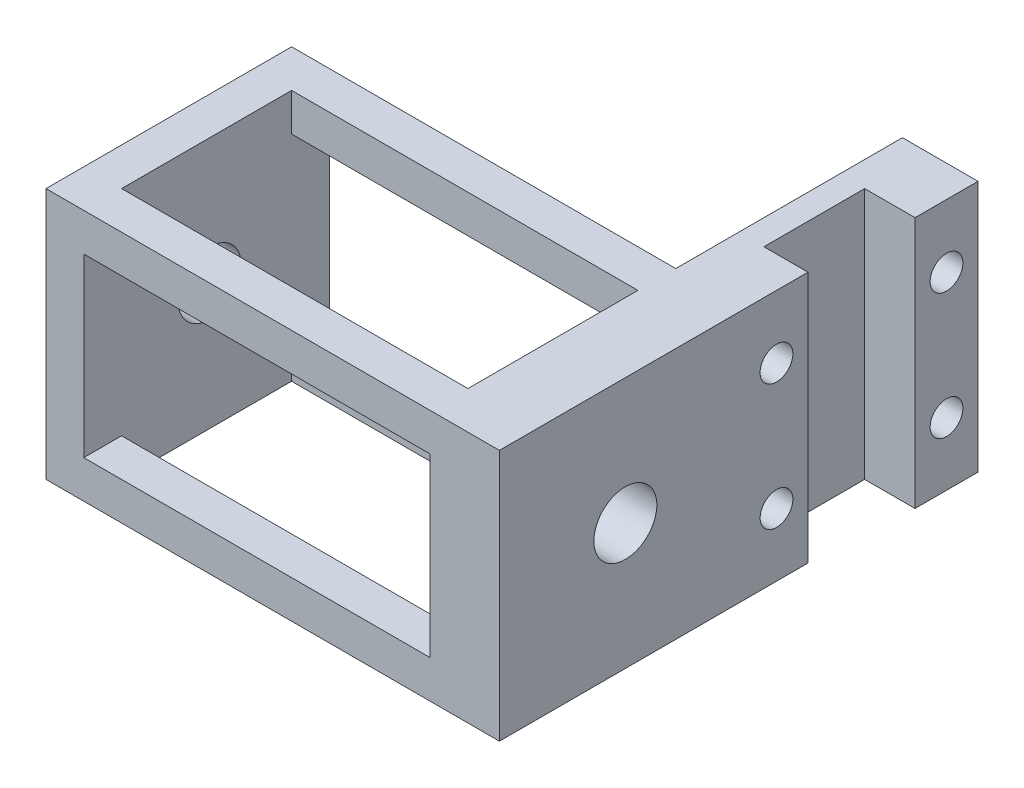
ISO-10303-21;
HEADER;
FILE_DESCRIPTION(('STEP AP214'),'2;1');
FILE_NAME('part.step','',(''),(''),'','','');
FILE_SCHEMA(('AUTOMOTIVE_DESIGN { 1 0 10303 214 1 1 1 1 }'));
ENDSEC;
DATA;
#1=APPLICATION_CONTEXT('core data for automotive mechanical design processes');
#2=APPLICATION_PROTOCOL_DEFINITION('international standard','automotive_design',2000,#1);
#3=PRODUCT_CONTEXT('',#1,'mechanical');
#4=PRODUCT('Part','Part','',(#3));
#5=PRODUCT_RELATED_PRODUCT_CATEGORY('part','',(#4));
#6=PRODUCT_DEFINITION_FORMATION('','',#4);
#7=PRODUCT_DEFINITION_CONTEXT('part definition',#1,'design');
#8=PRODUCT_DEFINITION('design','',#6,#7);
#9=PRODUCT_DEFINITION_SHAPE('','',#8);
#10=(LENGTH_UNIT() NAMED_UNIT(*) SI_UNIT(.MILLI.,.METRE.));
#11=(NAMED_UNIT(*) PLANE_ANGLE_UNIT() SI_UNIT($,.RADIAN.));
#12=(NAMED_UNIT(*) SI_UNIT($,.STERADIAN.) SOLID_ANGLE_UNIT());
#13=UNCERTAINTY_MEASURE_WITH_UNIT(LENGTH_MEASURE(1.E-05),#10,'distance_accuracy_value','');
#14=(GEOMETRIC_REPRESENTATION_CONTEXT(3) GLOBAL_UNCERTAINTY_ASSIGNED_CONTEXT((#13)) GLOBAL_UNIT_ASSIGNED_CONTEXT((#10,
#11,#12)) REPRESENTATION_CONTEXT('',''));
#15=CARTESIAN_POINT('',(0.,0.,0.));
#16=DIRECTION('',(0.,0.,1.));
#17=DIRECTION('',(1.,0.,0.));
#18=AXIS2_PLACEMENT_3D('',#15,#16,#17);
#19=CARTESIAN_POINT('',(-8.39344262295084,-0.001000000000001,19.1311475409836));
#20=DIRECTION('',(0.,0.,1.));
#21=DIRECTION('',(1.,0.,0.));
#22=AXIS2_PLACEMENT_3D('',#19,#20,#21);
#23=PLANE('',#22);
#24=DIRECTION('',(0.,1.,0.));
#25=VECTOR('',#24,1.);
#26=CARTESIAN_POINT('',(-8.39344262295084,-0.001000000000001,19.1311475409836));
#27=LINE('',#26,#25);
#28=CARTESIAN_POINT('',(-8.39344262295083,17.,19.1311475409836));
#29=VERTEX_POINT('',#28);
#30=CARTESIAN_POINT('',(-8.39344262295084,20.,19.1311475409836));
#31=VERTEX_POINT('',#30);
#32=EDGE_CURVE('E285',#29,#31,#27,.T.);
#33=ORIENTED_EDGE('',*,*,#32,.F.);
#34=DIRECTION('',(-1.,0.,0.));
#35=VECTOR('',#34,1.);
#36=CARTESIAN_POINT('',(-8.39344262295084,17.,19.1311475409836));
#37=LINE('',#36,#35);
#38=CARTESIAN_POINT('',(-35.8934426229508,17.,19.1311475409836));
#39=VERTEX_POINT('',#38);
#40=EDGE_CURVE('E241',#29,#39,#37,.T.);
#41=ORIENTED_EDGE('',*,*,#40,.T.);
#42=DIRECTION('',(0.,1.,0.));
#43=VECTOR('',#42,1.);
#44=CARTESIAN_POINT('',(-35.8934426229508,-0.001000000000001,19.1311475409836));
#45=LINE('',#44,#43);
#46=CARTESIAN_POINT('',(-35.8934426229508,20.,19.1311475409836));
#47=VERTEX_POINT('',#46);
#48=EDGE_CURVE('E287',#39,#47,#45,.T.);
#49=ORIENTED_EDGE('',*,*,#48,.T.);
#50=DIRECTION('',(1.,0.,0.));
#51=VECTOR('',#50,1.);
#52=CARTESIAN_POINT('',(-8.39344262295084,20.,19.1311475409836));
#53=LINE('',#52,#51);
#54=EDGE_CURVE('E273',#47,#31,#53,.T.);
#55=ORIENTED_EDGE('',*,*,#54,.T.);
#56=EDGE_LOOP('',(#33,#41,#49,#55));
#57=FACE_BOUND('',#56,.T.);
#58=ADVANCED_FACE('F44',(#57),#23,.F.);
#59=CARTESIAN_POINT('',(-8.39344262295084,-0.001000000000001,5.6311475409836));
#60=DIRECTION('',(0.,0.,-1.));
#61=DIRECTION('',(-1.,0.,0.));
#62=AXIS2_PLACEMENT_3D('',#59,#60,#61);
#63=PLANE('',#62);
#64=DIRECTION('',(0.,1.,0.));
#65=VECTOR('',#64,1.);
#66=CARTESIAN_POINT('',(-35.8934426229508,-0.001000000000001,5.6311475409836));
#67=LINE('',#66,#65);
#68=CARTESIAN_POINT('',(-35.8934426229508,17.,5.6311475409836));
#69=VERTEX_POINT('',#68);
#70=CARTESIAN_POINT('',(-35.8934426229508,20.,5.6311475409836));
#71=VERTEX_POINT('',#70);
#72=EDGE_CURVE('E295',#69,#71,#67,.T.);
#73=ORIENTED_EDGE('',*,*,#72,.F.);
#74=DIRECTION('',(1.,0.,0.));
#75=VECTOR('',#74,1.);
#76=CARTESIAN_POINT('',(-8.39344262295084,17.,5.6311475409836));
#77=LINE('',#76,#75);
#78=CARTESIAN_POINT('',(-8.39344262295083,17.,5.6311475409836));
#79=VERTEX_POINT('',#78);
#80=EDGE_CURVE('E54',#69,#79,#77,.T.);
#81=ORIENTED_EDGE('',*,*,#80,.T.);
#82=DIRECTION('',(0.,1.,0.));
#83=VECTOR('',#82,1.);
#84=CARTESIAN_POINT('',(-8.39344262295084,-0.001000000000001,5.6311475409836));
#85=LINE('',#84,#83);
#86=CARTESIAN_POINT('',(-8.39344262295084,20.,5.6311475409836));
#87=VERTEX_POINT('',#86);
#88=EDGE_CURVE('E279',#79,#87,#85,.T.);
#89=ORIENTED_EDGE('',*,*,#88,.T.);
#90=DIRECTION('',(-1.,0.,0.));
#91=VECTOR('',#90,1.);
#92=CARTESIAN_POINT('',(-8.39344262295084,20.,5.6311475409836));
#93=LINE('',#92,#91);
#94=EDGE_CURVE('E266',#87,#71,#93,.T.);
#95=ORIENTED_EDGE('',*,*,#94,.T.);
#96=EDGE_LOOP('',(#73,#81,#89,#95));
#97=FACE_BOUND('',#96,.T.);
#98=ADVANCED_FACE('F417',(#97),#63,.F.);
#99=CARTESIAN_POINT('',(-6.39344262295083,20.,-2.3688524590164));
#100=DIRECTION('',(0.,0.,1.));
#101=DIRECTION('',(1.,0.,0.));
#102=AXIS2_PLACEMENT_3D('',#99,#100,#101);
#103=PLANE('',#102);
#104=DIRECTION('',(-1.,0.,0.));
#105=VECTOR('',#104,1.);
#106=CARTESIAN_POINT('',(-6.39344262295083,0.,-2.3688524590164));
#107=LINE('',#106,#105);
#108=CARTESIAN_POINT('',(-2.89344262295083,0.,-2.3688524590164));
#109=VERTEX_POINT('',#108);
#110=CARTESIAN_POINT('',(-6.39344262295083,0.,-2.3688524590164));
#111=VERTEX_POINT('',#110);
#112=EDGE_CURVE('E321',#109,#111,#107,.T.);
#113=ORIENTED_EDGE('',*,*,#112,.T.);
#114=DIRECTION('',(0.,-1.,0.));
#115=VECTOR('',#114,1.);
#116=CARTESIAN_POINT('',(-6.39344262295083,20.,-2.3688524590164));
#117=LINE('',#116,#115);
#118=CARTESIAN_POINT('',(-6.39344262295083,20.,-2.3688524590164));
#119=VERTEX_POINT('',#118);
#120=EDGE_CURVE('E404',#119,#111,#117,.T.);
#121=ORIENTED_EDGE('',*,*,#120,.F.);
#122=DIRECTION('',(-1.,0.,0.));
#123=VECTOR('',#122,1.);
#124=CARTESIAN_POINT('',(-6.39344262295083,20.,-2.3688524590164));
#125=LINE('',#124,#123);
#126=CARTESIAN_POINT('',(-2.89344262295083,20.,-2.3688524590164));
#127=VERTEX_POINT('',#126);
#128=EDGE_CURVE('E328',#127,#119,#125,.T.);
#129=ORIENTED_EDGE('',*,*,#128,.F.);
#130=DIRECTION('',(0.,-1.,0.));
#131=VECTOR('',#130,1.);
#132=CARTESIAN_POINT('',(-2.89344262295083,20.,-2.3688524590164));
#133=LINE('',#132,#131);
#134=EDGE_CURVE('E356',#127,#109,#133,.T.);
#135=ORIENTED_EDGE('',*,*,#134,.T.);
#136=EDGE_LOOP('',(#113,#121,#129,#135));
#137=FACE_BOUND('',#136,.T.);
#138=ADVANCED_FACE('F50',(#137),#103,.F.);
#139=CARTESIAN_POINT('',(-6.39344262295083,20.,-10.3688524590164));
#140=DIRECTION('',(-1.,0.,0.));
#141=DIRECTION('',(0.,0.,1.));
#142=AXIS2_PLACEMENT_3D('',#139,#140,#141);
#143=PLANE('',#142);
#144=DIRECTION('',(0.,0.,-1.));
#145=VECTOR('',#144,1.);
#146=CARTESIAN_POINT('',(-6.39344262295083,0.,-10.3688524590164));
#147=LINE('',#146,#145);
#148=CARTESIAN_POINT('',(-6.39344262295083,0.,-10.3688524590164));
#149=VERTEX_POINT('',#148);
#150=EDGE_CURVE('E360',#111,#149,#147,.T.);
#151=ORIENTED_EDGE('',*,*,#150,.T.);
#152=DIRECTION('',(0.,-1.,0.));
#153=VECTOR('',#152,1.);
#154=CARTESIAN_POINT('',(-6.39344262295083,20.,-10.3688524590164));
#155=LINE('',#154,#153);
#156=CARTESIAN_POINT('',(-6.39344262295083,20.,-10.3688524590164));
#157=VERTEX_POINT('',#156);
#158=EDGE_CURVE('E400',#157,#149,#155,.T.);
#159=ORIENTED_EDGE('',*,*,#158,.F.);
#160=DIRECTION('',(0.,0.,-1.));
#161=VECTOR('',#160,1.);
#162=CARTESIAN_POINT('',(-6.39344262295083,20.,-10.3688524590164));
#163=LINE('',#162,#161);
#164=EDGE_CURVE('E334',#119,#157,#163,.T.);
#165=ORIENTED_EDGE('',*,*,#164,.F.);
#166=ORIENTED_EDGE('',*,*,#120,.T.);
#167=EDGE_LOOP('',(#151,#159,#165,#166));
#168=FACE_BOUND('',#167,.T.);
#169=ADVANCED_FACE('F541',(#168),#143,.F.);
#170=CARTESIAN_POINT('',(-2.39344262295083,20.,-10.3688524590164));
#171=DIRECTION('',(0.,0.,-1.));
#172=DIRECTION('',(-1.,0.,0.));
#173=AXIS2_PLACEMENT_3D('',#170,#171,#172);
#174=PLANE('',#173);
#175=DIRECTION('',(1.,0.,0.));
#176=VECTOR('',#175,1.);
#177=CARTESIAN_POINT('',(-2.39344262295083,0.,-10.3688524590164));
#178=LINE('',#177,#176);
#179=CARTESIAN_POINT('',(-2.39344262295083,0.,-10.3688524590164));
#180=VERTEX_POINT('',#179);
#181=EDGE_CURVE('E361',#149,#180,#178,.T.);
#182=ORIENTED_EDGE('',*,*,#181,.T.);
#183=DIRECTION('',(0.,-1.,0.));
#184=VECTOR('',#183,1.);
#185=CARTESIAN_POINT('',(-2.39344262295083,20.,-10.3688524590164));
#186=LINE('',#185,#184);
#187=CARTESIAN_POINT('',(-2.39344262295083,20.,-10.3688524590164));
#188=VERTEX_POINT('',#187);
#189=EDGE_CURVE('E396',#188,#180,#186,.T.);
#190=ORIENTED_EDGE('',*,*,#189,.F.);
#191=DIRECTION('',(1.,0.,0.));
#192=VECTOR('',#191,1.);
#193=CARTESIAN_POINT('',(-2.39344262295083,20.,-10.3688524590164));
#194=LINE('',#193,#192);
#195=EDGE_CURVE('E340',#157,#188,#194,.T.);
#196=ORIENTED_EDGE('',*,*,#195,.F.);
#197=ORIENTED_EDGE('',*,*,#158,.T.);
#198=EDGE_LOOP('',(#182,#190,#196,#197));
#199=FACE_BOUND('',#198,.T.);
#200=ADVANCED_FACE('F591',(#199),#174,.F.);
#201=CARTESIAN_POINT('',(-2.39344262295083,20.,-15.3688524590164));
#202=DIRECTION('',(-1.,0.,0.));
#203=DIRECTION('',(0.,0.,1.));
#204=AXIS2_PLACEMENT_3D('',#201,#202,#203);
#205=PLANE('',#204);
#206=CARTESIAN_POINT('',(-2.39344262295083,5.,-12.8688524590164));
#207=DIRECTION('',(1.,0.,0.));
#208=DIRECTION('',(0.,0.,-1.));
#209=AXIS2_PLACEMENT_3D('',#206,#207,#208);
#210=CIRCLE('',#209,1.3);
#211=CARTESIAN_POINT('',(-2.39344262295083,5.,-14.1688524590164));
#212=VERTEX_POINT('',#211);
#213=EDGE_CURVE('E495',#212,#212,#210,.T.);
#214=ORIENTED_EDGE('',*,*,#213,.F.);
#215=EDGE_LOOP('',(#214));
#216=FACE_BOUND('',#215,.T.);
#217=CARTESIAN_POINT('',(-2.39344262295083,15.,-12.8688524590164));
#218=DIRECTION('',(1.,0.,0.));
#219=DIRECTION('',(0.,0.,1.));
#220=AXIS2_PLACEMENT_3D('',#217,#218,#219);
#221=CIRCLE('',#220,1.3);
#222=CARTESIAN_POINT('',(-2.39344262295083,15.,-11.5688524590164));
#223=VERTEX_POINT('',#222);
#224=EDGE_CURVE('E488',#223,#223,#221,.T.);
#225=ORIENTED_EDGE('',*,*,#224,.F.);
#226=EDGE_LOOP('',(#225));
#227=FACE_BOUND('',#226,.T.);
#228=DIRECTION('',(0.,0.,-1.));
#229=VECTOR('',#228,1.);
#230=CARTESIAN_POINT('',(-2.39344262295083,0.,-15.3688524590164));
#231=LINE('',#230,#229);
#232=CARTESIAN_POINT('',(-2.39344262295083,0.,-15.3688524590164));
#233=VERTEX_POINT('',#232);
#234=EDGE_CURVE('E368',#180,#233,#231,.T.);
#235=ORIENTED_EDGE('',*,*,#234,.T.);
#236=DIRECTION('',(0.,-1.,0.));
#237=VECTOR('',#236,1.);
#238=CARTESIAN_POINT('',(-2.39344262295083,20.,-15.3688524590164));
#239=LINE('',#238,#237);
#240=CARTESIAN_POINT('',(-2.39344262295083,20.,-15.3688524590164));
#241=VERTEX_POINT('',#240);
#242=EDGE_CURVE('E395',#241,#233,#239,.T.);
#243=ORIENTED_EDGE('',*,*,#242,.F.);
#244=DIRECTION('',(0.,0.,-1.));
#245=VECTOR('',#244,1.);
#246=CARTESIAN_POINT('',(-2.39344262295083,20.,-15.3688524590164));
#247=LINE('',#246,#245);
#248=EDGE_CURVE('E339',#188,#241,#247,.T.);
#249=ORIENTED_EDGE('',*,*,#248,.F.);
#250=ORIENTED_EDGE('',*,*,#189,.T.);
#251=EDGE_LOOP('',(#235,#243,#249,#250));
#252=FACE_BOUND('',#251,.T.);
#253=ADVANCED_FACE('F594',(#216,#227,#252),#205,.F.);
#254=CARTESIAN_POINT('',(-8.39344262295084,20.,-15.3688524590164));
#255=DIRECTION('',(0.,0.,1.));
#256=DIRECTION('',(1.,0.,0.));
#257=AXIS2_PLACEMENT_3D('',#254,#255,#256);
#258=PLANE('',#257);
#259=DIRECTION('',(-1.,0.,0.));
#260=VECTOR('',#259,1.);
#261=CARTESIAN_POINT('',(-8.39344262295084,0.,-15.3688524590164));
#262=LINE('',#261,#260);
#263=CARTESIAN_POINT('',(-8.39344262295084,0.,-15.3688524590164));
#264=VERTEX_POINT('',#263);
#265=EDGE_CURVE('E369',#233,#264,#262,.T.);
#266=ORIENTED_EDGE('',*,*,#265,.T.);
#267=DIRECTION('',(0.,-1.,0.));
#268=VECTOR('',#267,1.);
#269=CARTESIAN_POINT('',(-8.39344262295084,20.,-15.3688524590164));
#270=LINE('',#269,#268);
#271=CARTESIAN_POINT('',(-8.39344262295084,20.,-15.3688524590164));
#272=VERTEX_POINT('',#271);
#273=EDGE_CURVE('E386',#272,#264,#270,.T.);
#274=ORIENTED_EDGE('',*,*,#273,.F.);
#275=DIRECTION('',(-1.,0.,0.));
#276=VECTOR('',#275,1.);
#277=CARTESIAN_POINT('',(-8.39344262295084,20.,-15.3688524590164));
#278=LINE('',#277,#276);
#279=EDGE_CURVE('E344',#241,#272,#278,.T.);
#280=ORIENTED_EDGE('',*,*,#279,.F.);
#281=ORIENTED_EDGE('',*,*,#242,.T.);
#282=EDGE_LOOP('',(#266,#274,#280,#281));
#283=FACE_BOUND('',#282,.T.);
#284=ADVANCED_FACE('F549',(#283),#258,.F.);
#285=CARTESIAN_POINT('',(-8.39344262295083,20.,22.1311475409836));
#286=DIRECTION('',(1.,0.,0.));
#287=DIRECTION('',(0.,0.,-1.));
#288=AXIS2_PLACEMENT_3D('',#285,#286,#287);
#289=PLANE('',#288);
#290=CARTESIAN_POINT('',(-8.39344262295083,5.,0.1311475409836));
#291=DIRECTION('',(1.,0.,0.));
#292=DIRECTION('',(0.,0.,-1.));
#293=AXIS2_PLACEMENT_3D('',#290,#291,#292);
#294=CIRCLE('',#293,1.3);
#295=CARTESIAN_POINT('',(-8.39344262295083,5.,-1.1688524590164));
#296=VERTEX_POINT('',#295);
#297=EDGE_CURVE('E500',#296,#296,#294,.F.);
#298=ORIENTED_EDGE('',*,*,#297,.F.);
#299=EDGE_LOOP('',(#298));
#300=FACE_BOUND('',#299,.T.);
#301=CARTESIAN_POINT('',(-8.39344262295083,15.,0.1311475409836));
#302=DIRECTION('',(1.,0.,0.));
#303=DIRECTION('',(0.,0.,-1.));
#304=AXIS2_PLACEMENT_3D('',#301,#302,#303);
#305=CIRCLE('',#304,1.3);
#306=CARTESIAN_POINT('',(-8.39344262295083,15.,-1.1688524590164));
#307=VERTEX_POINT('',#306);
#308=EDGE_CURVE('E508',#307,#307,#305,.F.);
#309=ORIENTED_EDGE('',*,*,#308,.F.);
#310=EDGE_LOOP('',(#309));
#311=FACE_BOUND('',#310,.T.);
#312=CARTESIAN_POINT('',(-8.39344262295084,5.,-12.8688524590164));
#313=DIRECTION('',(1.,0.,0.));
#314=DIRECTION('',(0.,0.,-1.));
#315=AXIS2_PLACEMENT_3D('',#312,#313,#314);
#316=CIRCLE('',#315,1.3);
#317=CARTESIAN_POINT('',(-8.39344262295084,5.,-14.1688524590164));
#318=VERTEX_POINT('',#317);
#319=EDGE_CURVE('E490',#318,#318,#316,.F.);
#320=ORIENTED_EDGE('',*,*,#319,.F.);
#321=EDGE_LOOP('',(#320));
#322=FACE_BOUND('',#321,.T.);
#323=CARTESIAN_POINT('',(-8.39344262295084,15.,-12.8688524590164));
#324=DIRECTION('',(1.,0.,0.));
#325=DIRECTION('',(0.,0.,-1.));
#326=AXIS2_PLACEMENT_3D('',#323,#324,#325);
#327=CIRCLE('',#326,1.3);
#328=CARTESIAN_POINT('',(-8.39344262295084,15.,-14.1688524590164));
#329=VERTEX_POINT('',#328);
#330=EDGE_CURVE('E492',#329,#329,#327,.F.);
#331=ORIENTED_EDGE('',*,*,#330,.F.);
#332=EDGE_LOOP('',(#331));
#333=FACE_BOUND('',#332,.T.);
#334=CARTESIAN_POINT('',(-8.39344262295083,10.,12.1311475409836));
#335=DIRECTION('',(1.,0.,0.));
#336=DIRECTION('',(0.,0.,-1.));
#337=AXIS2_PLACEMENT_3D('',#334,#335,#336);
#338=CIRCLE('',#337,2.5);
#339=CARTESIAN_POINT('',(-8.39344262295083,10.,9.6311475409836));
#340=VERTEX_POINT('',#339);
#341=EDGE_CURVE('E475',#340,#340,#338,.T.);
#342=ORIENTED_EDGE('',*,*,#341,.T.);
#343=EDGE_LOOP('',(#342));
#344=FACE_BOUND('',#343,.T.);
#345=ORIENTED_EDGE('',*,*,#273,.T.);
#346=DIRECTION('',(0.,0.,1.));
#347=VECTOR('',#346,1.);
#348=CARTESIAN_POINT('',(-8.39344262295083,0.,22.1311475409836));
#349=LINE('',#348,#347);
#350=CARTESIAN_POINT('',(-8.39344262295083,0.,2.6311475409836));
#351=VERTEX_POINT('',#350);
#352=EDGE_CURVE('E373',#264,#351,#349,.T.);
#353=ORIENTED_EDGE('',*,*,#352,.T.);
#354=DIRECTION('',(0.,1.,0.));
#355=VECTOR('',#354,1.);
#356=CARTESIAN_POINT('',(-8.39344262295083,0.,2.6311475409836));
#357=LINE('',#356,#355);
#358=CARTESIAN_POINT('',(-8.39344262295083,3.,2.6311475409836));
#359=VERTEX_POINT('',#358);
#360=EDGE_CURVE('E324',#351,#359,#357,.T.);
#361=ORIENTED_EDGE('',*,*,#360,.T.);
#362=DIRECTION('',(0.,0.,1.));
#363=VECTOR('',#362,1.);
#364=CARTESIAN_POINT('',(-8.39344262295083,3.,-15.3688524590164));
#365=LINE('',#364,#363);
#366=CARTESIAN_POINT('',(-8.39344262295083,3.,5.6311475409836));
#367=VERTEX_POINT('',#366);
#368=EDGE_CURVE('E70',#359,#367,#365,.T.);
#369=ORIENTED_EDGE('',*,*,#368,.T.);
#370=CARTESIAN_POINT('',(-8.39344262295084,0.,5.6311475409836));
#371=VERTEX_POINT('',#370);
#372=EDGE_CURVE('E291',#371,#367,#85,.T.);
#373=ORIENTED_EDGE('',*,*,#372,.F.);
#374=DIRECTION('',(0.,0.,-1.));
#375=VECTOR('',#374,1.);
#376=CARTESIAN_POINT('',(-8.39344262295084,0.,19.1311475409836));
#377=LINE('',#376,#375);
#378=CARTESIAN_POINT('',(-8.39344262295084,0.,19.1311475409836));
#379=VERTEX_POINT('',#378);
#380=EDGE_CURVE('E256',#379,#371,#377,.T.);
#381=ORIENTED_EDGE('',*,*,#380,.F.);
#382=CARTESIAN_POINT('',(-8.39344262295084,3.,19.1311475409836));
#383=VERTEX_POINT('',#382);
#384=EDGE_CURVE('E204',#379,#383,#27,.T.);
#385=ORIENTED_EDGE('',*,*,#384,.T.);
#386=CARTESIAN_POINT('',(-8.39344262295083,3.,22.1311475409836));
#387=VERTEX_POINT('',#386);
#388=EDGE_CURVE('E198',#383,#387,#365,.T.);
#389=ORIENTED_EDGE('',*,*,#388,.T.);
#390=DIRECTION('',(0.,1.,0.));
#391=VECTOR('',#390,1.);
#392=CARTESIAN_POINT('',(-8.39344262295083,17.,22.1311475409836));
#393=LINE('',#392,#391);
#394=CARTESIAN_POINT('',(-8.39344262295083,17.,22.1311475409836));
#395=VERTEX_POINT('',#394);
#396=EDGE_CURVE('E203',#387,#395,#393,.T.);
#397=ORIENTED_EDGE('',*,*,#396,.T.);
#398=DIRECTION('',(0.,0.,1.));
#399=VECTOR('',#398,1.);
#400=CARTESIAN_POINT('',(-8.39344262295083,17.,-15.3688524590164));
#401=LINE('',#400,#399);
#402=EDGE_CURVE('E232',#29,#395,#401,.T.);
#403=ORIENTED_EDGE('',*,*,#402,.F.);
#404=ORIENTED_EDGE('',*,*,#32,.T.);
#405=DIRECTION('',(0.,0.,-1.));
#406=VECTOR('',#405,1.);
#407=CARTESIAN_POINT('',(-8.39344262295084,20.,19.1311475409836));
#408=LINE('',#407,#406);
#409=EDGE_CURVE('E265',#31,#87,#408,.T.);
#410=ORIENTED_EDGE('',*,*,#409,.T.);
#411=ORIENTED_EDGE('',*,*,#88,.F.);
#412=CARTESIAN_POINT('',(-8.39344262295083,17.,2.6311475409836));
#413=VERTEX_POINT('',#412);
#414=EDGE_CURVE('E231',#413,#79,#401,.T.);
#415=ORIENTED_EDGE('',*,*,#414,.F.);
#416=CARTESIAN_POINT('',(-8.39344262295083,20.,2.6311475409836));
#417=VERTEX_POINT('',#416);
#418=EDGE_CURVE('E309',#413,#417,#357,.T.);
#419=ORIENTED_EDGE('',*,*,#418,.T.);
#420=DIRECTION('',(0.,0.,1.));
#421=VECTOR('',#420,1.);
#422=CARTESIAN_POINT('',(-8.39344262295083,20.,22.1311475409836));
#423=LINE('',#422,#421);
#424=EDGE_CURVE('E347',#272,#417,#423,.T.);
#425=ORIENTED_EDGE('',*,*,#424,.F.);
#426=EDGE_LOOP('',(#345,#353,#361,#369,#373,#381,#385,#389,#397,#403,#404,#410,#411,#415,#419,#425));
#427=FACE_BOUND('',#426,.T.);
#428=ADVANCED_FACE('F196',(#300,#311,#322,#333,#344,#427),#289,.F.);
#429=CARTESIAN_POINT('',(-2.89344262295083,20.,22.1311475409836));
#430=DIRECTION('',(0.,0.,-1.));
#431=DIRECTION('',(-1.,0.,0.));
#432=AXIS2_PLACEMENT_3D('',#429,#430,#431);
#433=PLANE('',#432);
#434=DIRECTION('',(1.,0.,0.));
#435=VECTOR('',#434,1.);
#436=CARTESIAN_POINT('',(-35.8934426229508,3.,22.1311475409836));
#437=LINE('',#436,#435);
#438=CARTESIAN_POINT('',(-35.8934426229508,3.,22.1311475409836));
#439=VERTEX_POINT('',#438);
#440=EDGE_CURVE('E211',#439,#387,#437,.T.);
#441=ORIENTED_EDGE('',*,*,#440,.F.);
#442=DIRECTION('',(0.,-1.,0.));
#443=VECTOR('',#442,1.);
#444=CARTESIAN_POINT('',(-35.8934426229508,17.,22.1311475409836));
#445=LINE('',#444,#443);
#446=CARTESIAN_POINT('',(-35.8934426229508,17.,22.1311475409836));
#447=VERTEX_POINT('',#446);
#448=EDGE_CURVE('E65',#447,#439,#445,.T.);
#449=ORIENTED_EDGE('',*,*,#448,.F.);
#450=DIRECTION('',(-1.,0.,0.));
#451=VECTOR('',#450,1.);
#452=CARTESIAN_POINT('',(-35.8934426229508,17.,22.1311475409836));
#453=LINE('',#452,#451);
#454=EDGE_CURVE('E219',#395,#447,#453,.T.);
#455=ORIENTED_EDGE('',*,*,#454,.F.);
#456=ORIENTED_EDGE('',*,*,#396,.F.);
#457=EDGE_LOOP('',(#441,#449,#455,#456));
#458=FACE_BOUND('',#457,.T.);
#459=DIRECTION('',(1.,0.,0.));
#460=VECTOR('',#459,1.);
#461=CARTESIAN_POINT('',(-2.89344262295083,0.,22.1311475409836));
#462=LINE('',#461,#460);
#463=CARTESIAN_POINT('',(-38.8934426229508,0.,22.1311475409836));
#464=VERTEX_POINT('',#463);
#465=CARTESIAN_POINT('',(-2.89344262295083,0.,22.1311475409836));
#466=VERTEX_POINT('',#465);
#467=EDGE_CURVE('E380',#464,#466,#462,.T.);
#468=ORIENTED_EDGE('',*,*,#467,.T.);
#469=DIRECTION('',(0.,-1.,0.));
#470=VECTOR('',#469,1.);
#471=CARTESIAN_POINT('',(-2.89344262295083,20.,22.1311475409836));
#472=LINE('',#471,#470);
#473=CARTESIAN_POINT('',(-2.89344262295083,20.,22.1311475409836));
#474=VERTEX_POINT('',#473);
#475=EDGE_CURVE('E384',#474,#466,#472,.T.);
#476=ORIENTED_EDGE('',*,*,#475,.F.);
#477=DIRECTION('',(1.,0.,0.));
#478=VECTOR('',#477,1.);
#479=CARTESIAN_POINT('',(-2.89344262295083,20.,22.1311475409836));
#480=LINE('',#479,#478);
#481=CARTESIAN_POINT('',(-38.8934426229508,20.,22.1311475409836));
#482=VERTEX_POINT('',#481);
#483=EDGE_CURVE('E348',#482,#474,#480,.T.);
#484=ORIENTED_EDGE('',*,*,#483,.F.);
#485=DIRECTION('',(0.,1.,0.));
#486=VECTOR('',#485,1.);
#487=CARTESIAN_POINT('',(-38.8934426229508,0.,22.1311475409836));
#488=LINE('',#487,#486);
#489=EDGE_CURVE('E320',#464,#482,#488,.T.);
#490=ORIENTED_EDGE('',*,*,#489,.F.);
#491=EDGE_LOOP('',(#468,#476,#484,#490));
#492=FACE_BOUND('',#491,.T.);
#493=ADVANCED_FACE('F220',(#458,#492),#433,.F.);
#494=CARTESIAN_POINT('',(-2.89344262295083,20.,-2.3688524590164));
#495=DIRECTION('',(-1.,0.,0.));
#496=DIRECTION('',(0.,0.,1.));
#497=AXIS2_PLACEMENT_3D('',#494,#495,#496);
#498=PLANE('',#497);
#499=CARTESIAN_POINT('',(-2.89344262295083,5.,0.1311475409836));
#500=DIRECTION('',(1.,0.,0.));
#501=DIRECTION('',(0.,0.,-1.));
#502=AXIS2_PLACEMENT_3D('',#499,#500,#501);
#503=CIRCLE('',#502,1.3);
#504=CARTESIAN_POINT('',(-2.89344262295083,5.,-1.1688524590164));
#505=VERTEX_POINT('',#504);
#506=EDGE_CURVE('E509',#505,#505,#503,.T.);
#507=ORIENTED_EDGE('',*,*,#506,.F.);
#508=EDGE_LOOP('',(#507));
#509=FACE_BOUND('',#508,.T.);
#510=CARTESIAN_POINT('',(-2.89344262295083,15.,0.1311475409836));
#511=DIRECTION('',(1.,0.,0.));
#512=DIRECTION('',(0.,0.,1.));
#513=AXIS2_PLACEMENT_3D('',#510,#511,#512);
#514=CIRCLE('',#513,1.3);
#515=CARTESIAN_POINT('',(-2.89344262295083,15.,1.4311475409836));
#516=VERTEX_POINT('',#515);
#517=EDGE_CURVE('E502',#516,#516,#514,.T.);
#518=ORIENTED_EDGE('',*,*,#517,.F.);
#519=EDGE_LOOP('',(#518));
#520=FACE_BOUND('',#519,.T.);
#521=CARTESIAN_POINT('',(-2.89344262295083,10.,12.1311475409836));
#522=DIRECTION('',(-1.,0.,0.));
#523=DIRECTION('',(0.,0.,1.));
#524=AXIS2_PLACEMENT_3D('',#521,#522,#523);
#525=CIRCLE('',#524,2.5);
#526=CARTESIAN_POINT('',(-2.89344262295083,10.,14.6311475409836));
#527=VERTEX_POINT('',#526);
#528=EDGE_CURVE('E480',#527,#527,#525,.T.);
#529=ORIENTED_EDGE('',*,*,#528,.T.);
#530=EDGE_LOOP('',(#529));
#531=FACE_BOUND('',#530,.T.);
#532=DIRECTION('',(0.,0.,-1.));
#533=VECTOR('',#532,1.);
#534=CARTESIAN_POINT('',(-2.89344262295083,0.,-2.3688524590164));
#535=LINE('',#534,#533);
#536=EDGE_CURVE('E331',#466,#109,#535,.T.);
#537=ORIENTED_EDGE('',*,*,#536,.T.);
#538=ORIENTED_EDGE('',*,*,#134,.F.);
#539=DIRECTION('',(0.,0.,-1.));
#540=VECTOR('',#539,1.);
#541=CARTESIAN_POINT('',(-2.89344262295083,20.,-2.3688524590164));
#542=LINE('',#541,#540);
#543=EDGE_CURVE('E351',#474,#127,#542,.T.);
#544=ORIENTED_EDGE('',*,*,#543,.F.);
#545=ORIENTED_EDGE('',*,*,#475,.T.);
#546=EDGE_LOOP('',(#537,#538,#544,#545));
#547=FACE_BOUND('',#546,.T.);
#548=ADVANCED_FACE('F524',(#509,#520,#531,#547),#498,.F.);
#549=CARTESIAN_POINT('',(0.,20.,0.));
#550=DIRECTION('',(0.,-1.,0.));
#551=DIRECTION('',(0.,0.,-1.));
#552=AXIS2_PLACEMENT_3D('',#549,#550,#551);
#553=PLANE('',#552);
#554=ORIENTED_EDGE('',*,*,#94,.F.);
#555=ORIENTED_EDGE('',*,*,#409,.F.);
#556=ORIENTED_EDGE('',*,*,#54,.F.);
#557=DIRECTION('',(0.,0.,1.));
#558=VECTOR('',#557,1.);
#559=CARTESIAN_POINT('',(-35.8934426229508,20.,19.1311475409836));
#560=LINE('',#559,#558);
#561=EDGE_CURVE('E269',#71,#47,#560,.T.);
#562=ORIENTED_EDGE('',*,*,#561,.F.);
#563=EDGE_LOOP('',(#554,#555,#556,#562));
#564=FACE_BOUND('',#563,.T.);
#565=ORIENTED_EDGE('',*,*,#128,.T.);
#566=ORIENTED_EDGE('',*,*,#164,.T.);
#567=ORIENTED_EDGE('',*,*,#195,.T.);
#568=ORIENTED_EDGE('',*,*,#248,.T.);
#569=ORIENTED_EDGE('',*,*,#279,.T.);
#570=ORIENTED_EDGE('',*,*,#424,.T.);
#571=DIRECTION('',(-1.,0.,0.));
#572=VECTOR('',#571,1.);
#573=CARTESIAN_POINT('',(-8.39344262295083,20.,2.6311475409836));
#574=LINE('',#573,#572);
#575=CARTESIAN_POINT('',(-38.8934426229508,20.,2.6311475409836));
#576=VERTEX_POINT('',#575);
#577=EDGE_CURVE('E299',#417,#576,#574,.T.);
#578=ORIENTED_EDGE('',*,*,#577,.T.);
#579=DIRECTION('',(0.,0.,1.));
#580=VECTOR('',#579,1.);
#581=CARTESIAN_POINT('',(-38.8934426229508,20.,22.1311475409836));
#582=LINE('',#581,#580);
#583=EDGE_CURVE('E308',#576,#482,#582,.T.);
#584=ORIENTED_EDGE('',*,*,#583,.T.);
#585=ORIENTED_EDGE('',*,*,#483,.T.);
#586=ORIENTED_EDGE('',*,*,#543,.T.);
#587=EDGE_LOOP('',(#565,#566,#567,#568,#569,#570,#578,#584,#585,#586));
#588=FACE_BOUND('',#587,.T.);
#589=ADVANCED_FACE('F459',(#564,#588),#553,.F.);
#590=CARTESIAN_POINT('',(0.,0.,0.));
#591=DIRECTION('',(0.,-1.,0.));
#592=DIRECTION('',(0.,0.,-1.));
#593=AXIS2_PLACEMENT_3D('',#590,#591,#592);
#594=PLANE('',#593);
#595=ORIENTED_EDGE('',*,*,#380,.T.);
#596=DIRECTION('',(-1.,0.,0.));
#597=VECTOR('',#596,1.);
#598=CARTESIAN_POINT('',(-8.39344262295084,0.,5.6311475409836));
#599=LINE('',#598,#597);
#600=CARTESIAN_POINT('',(-35.8934426229508,0.,5.6311475409836));
#601=VERTEX_POINT('',#600);
#602=EDGE_CURVE('E283',#371,#601,#599,.T.);
#603=ORIENTED_EDGE('',*,*,#602,.T.);
#604=DIRECTION('',(0.,0.,1.));
#605=VECTOR('',#604,1.);
#606=CARTESIAN_POINT('',(-35.8934426229508,0.,19.1311475409836));
#607=LINE('',#606,#605);
#608=CARTESIAN_POINT('',(-35.8934426229508,0.,19.1311475409836));
#609=VERTEX_POINT('',#608);
#610=EDGE_CURVE('E250',#601,#609,#607,.T.);
#611=ORIENTED_EDGE('',*,*,#610,.T.);
#612=DIRECTION('',(1.,0.,0.));
#613=VECTOR('',#612,1.);
#614=CARTESIAN_POINT('',(-8.39344262295084,0.,19.1311475409836));
#615=LINE('',#614,#613);
#616=EDGE_CURVE('E255',#609,#379,#615,.T.);
#617=ORIENTED_EDGE('',*,*,#616,.T.);
#618=EDGE_LOOP('',(#595,#603,#611,#617));
#619=FACE_BOUND('',#618,.T.);
#620=ORIENTED_EDGE('',*,*,#112,.F.);
#621=ORIENTED_EDGE('',*,*,#536,.F.);
#622=ORIENTED_EDGE('',*,*,#467,.F.);
#623=DIRECTION('',(0.,0.,1.));
#624=VECTOR('',#623,1.);
#625=CARTESIAN_POINT('',(-38.8934426229508,0.,22.1311475409836));
#626=LINE('',#625,#624);
#627=CARTESIAN_POINT('',(-38.8934426229508,0.,2.6311475409836));
#628=VERTEX_POINT('',#627);
#629=EDGE_CURVE('E305',#628,#464,#626,.T.);
#630=ORIENTED_EDGE('',*,*,#629,.F.);
#631=DIRECTION('',(-1.,0.,0.));
#632=VECTOR('',#631,1.);
#633=CARTESIAN_POINT('',(-8.39344262295083,0.,2.6311475409836));
#634=LINE('',#633,#632);
#635=EDGE_CURVE('E301',#351,#628,#634,.T.);
#636=ORIENTED_EDGE('',*,*,#635,.F.);
#637=ORIENTED_EDGE('',*,*,#352,.F.);
#638=ORIENTED_EDGE('',*,*,#265,.F.);
#639=ORIENTED_EDGE('',*,*,#234,.F.);
#640=ORIENTED_EDGE('',*,*,#181,.F.);
#641=ORIENTED_EDGE('',*,*,#150,.F.);
#642=EDGE_LOOP('',(#620,#621,#622,#630,#636,#637,#638,#639,#640,#641));
#643=FACE_BOUND('',#642,.T.);
#644=ADVANCED_FACE('F442',(#619,#643),#594,.T.);
#645=CARTESIAN_POINT('',(-38.8934426229508,0.,22.1311475409836));
#646=DIRECTION('',(-1.,0.,0.));
#647=DIRECTION('',(0.,0.,1.));
#648=AXIS2_PLACEMENT_3D('',#645,#646,#647);
#649=PLANE('',#648);
#650=CARTESIAN_POINT('',(-38.8934426229508,10.,12.1311475409836));
#651=DIRECTION('',(-1.,0.,0.));
#652=DIRECTION('',(0.,0.,1.));
#653=AXIS2_PLACEMENT_3D('',#650,#651,#652);
#654=CIRCLE('',#653,2.5);
#655=CARTESIAN_POINT('',(-38.8934426229508,10.,14.6311475409836));
#656=VERTEX_POINT('',#655);
#657=EDGE_CURVE('E483',#656,#656,#654,.T.);
#658=ORIENTED_EDGE('',*,*,#657,.F.);
#659=EDGE_LOOP('',(#658));
#660=FACE_BOUND('',#659,.T.);
#661=ORIENTED_EDGE('',*,*,#583,.F.);
#662=DIRECTION('',(0.,1.,0.));
#663=VECTOR('',#662,1.);
#664=CARTESIAN_POINT('',(-38.8934426229508,0.,2.6311475409836));
#665=LINE('',#664,#663);
#666=EDGE_CURVE('E325',#628,#576,#665,.T.);
#667=ORIENTED_EDGE('',*,*,#666,.F.);
#668=ORIENTED_EDGE('',*,*,#629,.T.);
#669=ORIENTED_EDGE('',*,*,#489,.T.);
#670=EDGE_LOOP('',(#661,#667,#668,#669));
#671=FACE_BOUND('',#670,.T.);
#672=ADVANCED_FACE('F455',(#660,#671),#649,.T.);
#673=CARTESIAN_POINT('',(-8.39344262295083,0.,2.6311475409836));
#674=DIRECTION('',(0.,0.,-1.));
#675=DIRECTION('',(-1.,0.,0.));
#676=AXIS2_PLACEMENT_3D('',#673,#674,#675);
#677=PLANE('',#676);
#678=DIRECTION('',(1.,0.,0.));
#679=VECTOR('',#678,1.);
#680=CARTESIAN_POINT('',(-8.39344262295083,17.,2.6311475409836));
#681=LINE('',#680,#679);
#682=CARTESIAN_POINT('',(-35.8934426229508,17.,2.6311475409836));
#683=VERTEX_POINT('',#682);
#684=EDGE_CURVE('E247',#683,#413,#681,.T.);
#685=ORIENTED_EDGE('',*,*,#684,.F.);
#686=DIRECTION('',(0.,1.,0.));
#687=VECTOR('',#686,1.);
#688=CARTESIAN_POINT('',(-35.8934426229508,0.,2.6311475409836));
#689=LINE('',#688,#687);
#690=CARTESIAN_POINT('',(-35.8934426229508,3.,2.6311475409836));
#691=VERTEX_POINT('',#690);
#692=EDGE_CURVE('E11',#691,#683,#689,.T.);
#693=ORIENTED_EDGE('',*,*,#692,.F.);
#694=DIRECTION('',(-1.,0.,0.));
#695=VECTOR('',#694,1.);
#696=CARTESIAN_POINT('',(-8.39344262295083,3.,2.6311475409836));
#697=LINE('',#696,#695);
#698=EDGE_CURVE('E238',#359,#691,#697,.T.);
#699=ORIENTED_EDGE('',*,*,#698,.F.);
#700=ORIENTED_EDGE('',*,*,#360,.F.);
#701=ORIENTED_EDGE('',*,*,#635,.T.);
#702=ORIENTED_EDGE('',*,*,#666,.T.);
#703=ORIENTED_EDGE('',*,*,#577,.F.);
#704=ORIENTED_EDGE('',*,*,#418,.F.);
#705=EDGE_LOOP('',(#685,#693,#699,#700,#701,#702,#703,#704));
#706=FACE_BOUND('',#705,.T.);
#707=ADVANCED_FACE('F450',(#706),#677,.T.);
#708=CARTESIAN_POINT('',(-35.8934426229508,3.,19.1311475409836));
#709=VERTEX_POINT('',#708);
#710=EDGE_CURVE('E281',#609,#709,#45,.T.);
#711=ORIENTED_EDGE('',*,*,#710,.T.);
#712=DIRECTION('',(1.,0.,0.));
#713=VECTOR('',#712,1.);
#714=CARTESIAN_POINT('',(-8.39344262295084,3.,19.1311475409836));
#715=LINE('',#714,#713);
#716=EDGE_CURVE('E240',#709,#383,#715,.T.);
#717=ORIENTED_EDGE('',*,*,#716,.T.);
#718=ORIENTED_EDGE('',*,*,#384,.F.);
#719=ORIENTED_EDGE('',*,*,#616,.F.);
#720=EDGE_LOOP('',(#711,#717,#718,#719));
#721=FACE_BOUND('',#720,.T.);
#722=ADVANCED_FACE('F553',(#721),#23,.F.);
#723=CARTESIAN_POINT('',(-35.8934426229508,-0.001000000000001,19.1311475409836));
#724=DIRECTION('',(-1.,0.,0.));
#725=DIRECTION('',(0.,0.,1.));
#726=AXIS2_PLACEMENT_3D('',#723,#724,#725);
#727=PLANE('',#726);
#728=CARTESIAN_POINT('',(-35.8934426229508,10.,12.1311475409836));
#729=DIRECTION('',(-1.,0.,0.));
#730=DIRECTION('',(0.,0.,1.));
#731=AXIS2_PLACEMENT_3D('',#728,#729,#730);
#732=CIRCLE('',#731,2.5);
#733=CARTESIAN_POINT('',(-35.8934426229508,10.,14.6311475409836));
#734=VERTEX_POINT('',#733);
#735=EDGE_CURVE('E47',#734,#734,#732,.T.);
#736=ORIENTED_EDGE('',*,*,#735,.T.);
#737=EDGE_LOOP('',(#736));
#738=FACE_BOUND('',#737,.T.);
#739=CARTESIAN_POINT('',(-35.8934426229508,3.,5.6311475409836));
#740=VERTEX_POINT('',#739);
#741=EDGE_CURVE('E289',#601,#740,#67,.T.);
#742=ORIENTED_EDGE('',*,*,#741,.T.);
#743=DIRECTION('',(0.,0.,1.));
#744=VECTOR('',#743,1.);
#745=CARTESIAN_POINT('',(-35.8934426229508,3.,-15.3688524590164));
#746=LINE('',#745,#744);
#747=EDGE_CURVE('E208',#691,#740,#746,.T.);
#748=ORIENTED_EDGE('',*,*,#747,.F.);
#749=ORIENTED_EDGE('',*,*,#692,.T.);
#750=DIRECTION('',(0.,0.,1.));
#751=VECTOR('',#750,1.);
#752=CARTESIAN_POINT('',(-35.8934426229508,17.,-15.3688524590164));
#753=LINE('',#752,#751);
#754=EDGE_CURVE('E229',#683,#69,#753,.T.);
#755=ORIENTED_EDGE('',*,*,#754,.T.);
#756=ORIENTED_EDGE('',*,*,#72,.T.);
#757=ORIENTED_EDGE('',*,*,#561,.T.);
#758=ORIENTED_EDGE('',*,*,#48,.F.);
#759=EDGE_CURVE('E230',#39,#447,#753,.T.);
#760=ORIENTED_EDGE('',*,*,#759,.T.);
#761=ORIENTED_EDGE('',*,*,#448,.T.);
#762=EDGE_CURVE('E213',#709,#439,#746,.T.);
#763=ORIENTED_EDGE('',*,*,#762,.F.);
#764=ORIENTED_EDGE('',*,*,#710,.F.);
#765=ORIENTED_EDGE('',*,*,#610,.F.);
#766=EDGE_LOOP('',(#742,#748,#749,#755,#756,#757,#758,#760,#761,#763,#764,#765));
#767=FACE_BOUND('',#766,.T.);
#768=ADVANCED_FACE('F437',(#738,#767),#727,.F.);
#769=ORIENTED_EDGE('',*,*,#372,.T.);
#770=DIRECTION('',(-1.,0.,0.));
#771=VECTOR('',#770,1.);
#772=CARTESIAN_POINT('',(-8.39344262295084,3.,5.6311475409836));
#773=LINE('',#772,#771);
#774=EDGE_CURVE('E406',#367,#740,#773,.T.);
#775=ORIENTED_EDGE('',*,*,#774,.T.);
#776=ORIENTED_EDGE('',*,*,#741,.F.);
#777=ORIENTED_EDGE('',*,*,#602,.F.);
#778=EDGE_LOOP('',(#769,#775,#776,#777));
#779=FACE_BOUND('',#778,.T.);
#780=ADVANCED_FACE('F434',(#779),#63,.F.);
#781=CARTESIAN_POINT('',(-35.8934426229508,17.,-15.3688524590164));
#782=DIRECTION('',(0.,1.,0.));
#783=DIRECTION('',(0.,0.,1.));
#784=AXIS2_PLACEMENT_3D('',#781,#782,#783);
#785=PLANE('',#784);
#786=ORIENTED_EDGE('',*,*,#684,.T.);
#787=ORIENTED_EDGE('',*,*,#414,.T.);
#788=ORIENTED_EDGE('',*,*,#80,.F.);
#789=ORIENTED_EDGE('',*,*,#754,.F.);
#790=EDGE_LOOP('',(#786,#787,#788,#789));
#791=FACE_BOUND('',#790,.T.);
#792=ADVANCED_FACE('F677',(#791),#785,.F.);
#793=CARTESIAN_POINT('',(-35.8934426229508,3.,-15.3688524590164));
#794=DIRECTION('',(0.,-1.,0.));
#795=DIRECTION('',(0.,0.,-1.));
#796=AXIS2_PLACEMENT_3D('',#793,#794,#795);
#797=PLANE('',#796);
#798=ORIENTED_EDGE('',*,*,#698,.T.);
#799=ORIENTED_EDGE('',*,*,#747,.T.);
#800=ORIENTED_EDGE('',*,*,#774,.F.);
#801=ORIENTED_EDGE('',*,*,#368,.F.);
#802=EDGE_LOOP('',(#798,#799,#800,#801));
#803=FACE_BOUND('',#802,.T.);
#804=ADVANCED_FACE('F435',(#803),#797,.F.);
#805=ORIENTED_EDGE('',*,*,#402,.T.);
#806=ORIENTED_EDGE('',*,*,#454,.T.);
#807=ORIENTED_EDGE('',*,*,#759,.F.);
#808=ORIENTED_EDGE('',*,*,#40,.F.);
#809=EDGE_LOOP('',(#805,#806,#807,#808));
#810=FACE_BOUND('',#809,.T.);
#811=ADVANCED_FACE('F472',(#810),#785,.F.);
#812=ORIENTED_EDGE('',*,*,#762,.T.);
#813=ORIENTED_EDGE('',*,*,#440,.T.);
#814=ORIENTED_EDGE('',*,*,#388,.F.);
#815=ORIENTED_EDGE('',*,*,#716,.F.);
#816=EDGE_LOOP('',(#812,#813,#814,#815));
#817=FACE_BOUND('',#816,.T.);
#818=ADVANCED_FACE('F215',(#817),#797,.F.);
#819=CARTESIAN_POINT('',(-2.39344262295083,10.,12.1311475409836));
#820=DIRECTION('',(-1.,0.,0.));
#821=DIRECTION('',(0.,0.,1.));
#822=AXIS2_PLACEMENT_3D('',#819,#820,#821);
#823=CYLINDRICAL_SURFACE('',#822,2.5);
#824=ORIENTED_EDGE('',*,*,#657,.T.);
#825=EDGE_LOOP('',(#824));
#826=FACE_BOUND('',#825,.T.);
#827=ORIENTED_EDGE('',*,*,#735,.F.);
#828=EDGE_LOOP('',(#827));
#829=FACE_BOUND('',#828,.T.);
#830=ADVANCED_FACE('F715',(#826,#829),#823,.F.);
#831=ORIENTED_EDGE('',*,*,#528,.F.);
#832=EDGE_LOOP('',(#831));
#833=FACE_BOUND('',#832,.T.);
#834=ORIENTED_EDGE('',*,*,#341,.F.);
#835=EDGE_LOOP('',(#834));
#836=FACE_BOUND('',#835,.T.);
#837=ADVANCED_FACE('F716',(#833,#836),#823,.F.);
#838=CARTESIAN_POINT('',(-38.8944426229508,15.,-12.8688524590164));
#839=DIRECTION('',(1.,0.,0.));
#840=DIRECTION('',(0.,0.,-1.));
#841=AXIS2_PLACEMENT_3D('',#838,#839,#840);
#842=CYLINDRICAL_SURFACE('',#841,1.3);
#843=ORIENTED_EDGE('',*,*,#224,.T.);
#844=EDGE_LOOP('',(#843));
#845=FACE_BOUND('',#844,.T.);
#846=ORIENTED_EDGE('',*,*,#330,.T.);
#847=EDGE_LOOP('',(#846));
#848=FACE_BOUND('',#847,.T.);
#849=ADVANCED_FACE('F729',(#845,#848),#842,.F.);
#850=CARTESIAN_POINT('',(-38.8944426229508,5.,-12.8688524590164));
#851=DIRECTION('',(1.,0.,0.));
#852=DIRECTION('',(0.,0.,-1.));
#853=AXIS2_PLACEMENT_3D('',#850,#851,#852);
#854=CYLINDRICAL_SURFACE('',#853,1.3);
#855=ORIENTED_EDGE('',*,*,#213,.T.);
#856=EDGE_LOOP('',(#855));
#857=FACE_BOUND('',#856,.T.);
#858=ORIENTED_EDGE('',*,*,#319,.T.);
#859=EDGE_LOOP('',(#858));
#860=FACE_BOUND('',#859,.T.);
#861=ADVANCED_FACE('F738',(#857,#860),#854,.F.);
#862=CARTESIAN_POINT('',(-38.8944426229508,15.,0.131147540983599));
#863=DIRECTION('',(1.,0.,0.));
#864=DIRECTION('',(0.,0.,-1.));
#865=AXIS2_PLACEMENT_3D('',#862,#863,#864);
#866=CYLINDRICAL_SURFACE('',#865,1.3);
#867=ORIENTED_EDGE('',*,*,#517,.T.);
#868=EDGE_LOOP('',(#867));
#869=FACE_BOUND('',#868,.T.);
#870=ORIENTED_EDGE('',*,*,#308,.T.);
#871=EDGE_LOOP('',(#870));
#872=FACE_BOUND('',#871,.T.);
#873=ADVANCED_FACE('F745',(#869,#872),#866,.F.);
#874=CARTESIAN_POINT('',(-38.8944426229508,5.,0.131147540983599));
#875=DIRECTION('',(1.,0.,0.));
#876=DIRECTION('',(0.,0.,-1.));
#877=AXIS2_PLACEMENT_3D('',#874,#875,#876);
#878=CYLINDRICAL_SURFACE('',#877,1.3);
#879=ORIENTED_EDGE('',*,*,#506,.T.);
#880=EDGE_LOOP('',(#879));
#881=FACE_BOUND('',#880,.T.);
#882=ORIENTED_EDGE('',*,*,#297,.T.);
#883=EDGE_LOOP('',(#882));
#884=FACE_BOUND('',#883,.T.);
#885=ADVANCED_FACE('F519',(#881,#884),#878,.F.);
#886=CLOSED_SHELL('',(#58,#98,#138,#169,#200,#253,#284,#428,#493,#548,#589,#644,#672,#707,#722,
#768,#780,#792,#804,#811,#818,#830,#837,#849,#861,#873,#885));
#887=MANIFOLD_SOLID_BREP('B2',#886);
#888=ADVANCED_BREP_SHAPE_REPRESENTATION('',(#18,#887),#14);
#889=SHAPE_DEFINITION_REPRESENTATION(#9,#888);
ENDSEC;
END-ISO-10303-21;
